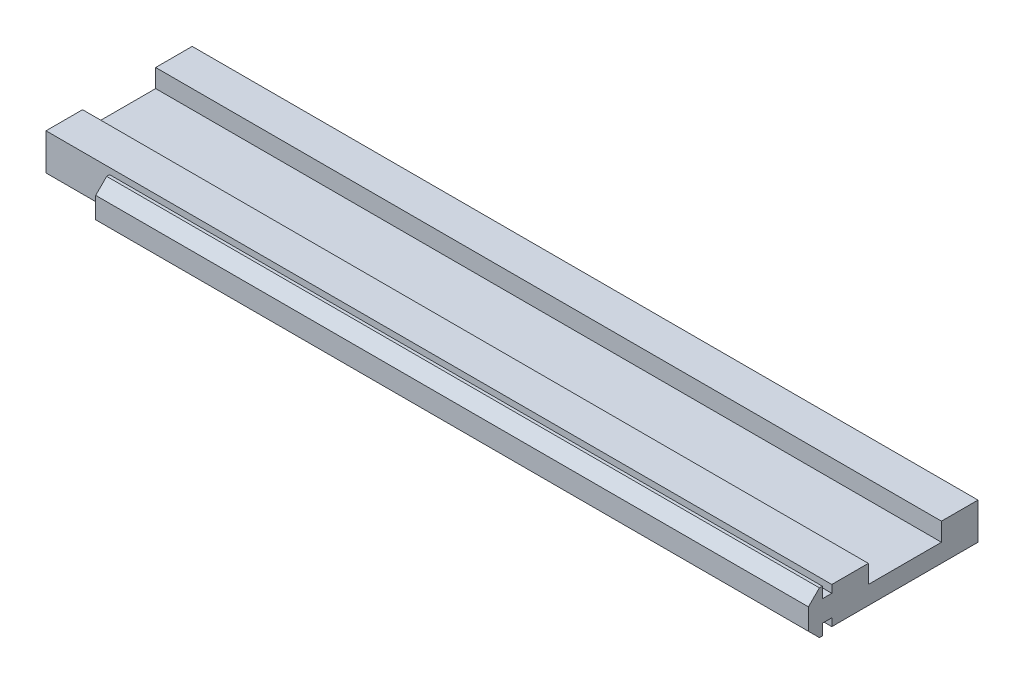
ISO-10303-21;
HEADER;
FILE_DESCRIPTION(('STEP AP214'),'2;1');
FILE_NAME('part.step','',(''),(''),'','','');
FILE_SCHEMA(('AUTOMOTIVE_DESIGN { 1 0 10303 214 1 1 1 1 }'));
ENDSEC;
DATA;
#1=APPLICATION_CONTEXT('core data for automotive mechanical design processes');
#2=APPLICATION_PROTOCOL_DEFINITION('international standard','automotive_design',2000,#1);
#3=PRODUCT_CONTEXT('',#1,'mechanical');
#4=PRODUCT('Part','Part','',(#3));
#5=PRODUCT_RELATED_PRODUCT_CATEGORY('part','',(#4));
#6=PRODUCT_DEFINITION_FORMATION('','',#4);
#7=PRODUCT_DEFINITION_CONTEXT('part definition',#1,'design');
#8=PRODUCT_DEFINITION('design','',#6,#7);
#9=PRODUCT_DEFINITION_SHAPE('','',#8);
#10=(LENGTH_UNIT() NAMED_UNIT(*) SI_UNIT(.MILLI.,.METRE.));
#11=(NAMED_UNIT(*) PLANE_ANGLE_UNIT() SI_UNIT($,.RADIAN.));
#12=(NAMED_UNIT(*) SI_UNIT($,.STERADIAN.) SOLID_ANGLE_UNIT());
#13=UNCERTAINTY_MEASURE_WITH_UNIT(LENGTH_MEASURE(1.E-05),#10,'distance_accuracy_value','');
#14=(GEOMETRIC_REPRESENTATION_CONTEXT(3) GLOBAL_UNCERTAINTY_ASSIGNED_CONTEXT((#13)) GLOBAL_UNIT_ASSIGNED_CONTEXT((#10,
#11,#12)) REPRESENTATION_CONTEXT('',''));
#15=CARTESIAN_POINT('',(0.,0.,0.));
#16=DIRECTION('',(0.,0.,1.));
#17=DIRECTION('',(1.,0.,0.));
#18=AXIS2_PLACEMENT_3D('',#15,#16,#17);
#19=CARTESIAN_POINT('',(925.,0.,90.1082240909334));
#20=DIRECTION('',(0.,0.,-1.));
#21=DIRECTION('',(-1.,0.,0.));
#22=AXIS2_PLACEMENT_3D('',#19,#20,#21);
#23=PLANE('',#22);
#24=DIRECTION('',(-1.,0.,0.));
#25=VECTOR('',#24,1.);
#26=CARTESIAN_POINT('',(925.,4.99999999999999,90.1082240909334));
#27=LINE('',#26,#25);
#28=CARTESIAN_POINT('',(710.,4.99999999999999,90.1082240909334));
#29=VERTEX_POINT('',#28);
#30=CARTESIAN_POINT('',(495.,4.99999999999999,90.1082240909334));
#31=VERTEX_POINT('',#30);
#32=EDGE_CURVE('E50',#29,#31,#27,.T.);
#33=ORIENTED_EDGE('',*,*,#32,.F.);
#34=DIRECTION('',(0.,-1.,0.));
#35=VECTOR('',#34,1.);
#36=CARTESIAN_POINT('',(710.,0.,90.1082240909334));
#37=LINE('',#36,#35);
#38=CARTESIAN_POINT('',(710.,-5.00000000000001,90.1082240909334));
#39=VERTEX_POINT('',#38);
#40=EDGE_CURVE('E231',#29,#39,#37,.T.);
#41=ORIENTED_EDGE('',*,*,#40,.T.);
#42=DIRECTION('',(-1.,0.,0.));
#43=VECTOR('',#42,1.);
#44=CARTESIAN_POINT('',(925.,-5.00000000000001,90.1082240909334));
#45=LINE('',#44,#43);
#46=CARTESIAN_POINT('',(495.,-5.00000000000001,90.1082240909334));
#47=VERTEX_POINT('',#46);
#48=EDGE_CURVE('E275',#39,#47,#45,.T.);
#49=ORIENTED_EDGE('',*,*,#48,.T.);
#50=DIRECTION('',(0.,-1.,0.));
#51=VECTOR('',#50,1.);
#52=CARTESIAN_POINT('',(495.,0.,90.1082240909334));
#53=LINE('',#52,#51);
#54=EDGE_CURVE('E251',#31,#47,#53,.T.);
#55=ORIENTED_EDGE('',*,*,#54,.F.);
#56=EDGE_LOOP('',(#33,#41,#49,#55));
#57=FACE_BOUND('',#56,.T.);
#58=ADVANCED_FACE('F43',(#57),#23,.T.);
#59=CARTESIAN_POINT('',(925.,4.99999999999999,0.));
#60=DIRECTION('',(0.,1.,0.));
#61=DIRECTION('',(0.,0.,1.));
#62=AXIS2_PLACEMENT_3D('',#59,#60,#61);
#63=PLANE('',#62);
#64=DIRECTION('',(-1.,0.,0.));
#65=VECTOR('',#64,1.);
#66=CARTESIAN_POINT('',(925.,4.99999999999999,100.108224090933));
#67=LINE('',#66,#65);
#68=CARTESIAN_POINT('',(710.,4.99999999999999,100.108224090933));
#69=VERTEX_POINT('',#68);
#70=CARTESIAN_POINT('',(495.,4.99999999999999,100.108224090933));
#71=VERTEX_POINT('',#70);
#72=EDGE_CURVE('E287',#69,#71,#67,.T.);
#73=ORIENTED_EDGE('',*,*,#72,.F.);
#74=DIRECTION('',(0.,0.,-1.));
#75=VECTOR('',#74,1.);
#76=CARTESIAN_POINT('',(710.,4.99999999999999,0.));
#77=LINE('',#76,#75);
#78=EDGE_CURVE('E247',#69,#29,#77,.T.);
#79=ORIENTED_EDGE('',*,*,#78,.T.);
#80=ORIENTED_EDGE('',*,*,#32,.T.);
#81=DIRECTION('',(0.,0.,-1.));
#82=VECTOR('',#81,1.);
#83=CARTESIAN_POINT('',(495.,4.99999999999999,0.));
#84=LINE('',#83,#82);
#85=EDGE_CURVE('E254',#71,#31,#84,.T.);
#86=ORIENTED_EDGE('',*,*,#85,.F.);
#87=EDGE_LOOP('',(#73,#79,#80,#86));
#88=FACE_BOUND('',#87,.T.);
#89=ADVANCED_FACE('F293',(#88),#63,.T.);
#90=CARTESIAN_POINT('',(925.,0.,100.108224090933));
#91=DIRECTION('',(0.,0.,1.));
#92=DIRECTION('',(1.,0.,0.));
#93=AXIS2_PLACEMENT_3D('',#90,#91,#92);
#94=PLANE('',#93);
#95=DIRECTION('',(-1.,0.,0.));
#96=VECTOR('',#95,1.);
#97=CARTESIAN_POINT('',(925.,0.,100.108224090933));
#98=LINE('',#97,#96);
#99=CARTESIAN_POINT('',(710.,0.,100.108224090933));
#100=VERTEX_POINT('',#99);
#101=CARTESIAN_POINT('',(495.,0.,100.108224090933));
#102=VERTEX_POINT('',#101);
#103=EDGE_CURVE('E285',#100,#102,#98,.T.);
#104=ORIENTED_EDGE('',*,*,#103,.F.);
#105=DIRECTION('',(0.,1.,0.));
#106=VECTOR('',#105,1.);
#107=CARTESIAN_POINT('',(710.,0.,100.108224090933));
#108=LINE('',#107,#106);
#109=EDGE_CURVE('E244',#100,#69,#108,.T.);
#110=ORIENTED_EDGE('',*,*,#109,.T.);
#111=ORIENTED_EDGE('',*,*,#72,.T.);
#112=DIRECTION('',(0.,1.,0.));
#113=VECTOR('',#112,1.);
#114=CARTESIAN_POINT('',(495.,0.,100.108224090933));
#115=LINE('',#114,#113);
#116=EDGE_CURVE('E257',#102,#71,#115,.T.);
#117=ORIENTED_EDGE('',*,*,#116,.F.);
#118=EDGE_LOOP('',(#104,#110,#111,#117));
#119=FACE_BOUND('',#118,.T.);
#120=ADVANCED_FACE('F303',(#119),#94,.T.);
#121=CARTESIAN_POINT('',(925.,0.,0.));
#122=DIRECTION('',(0.,1.,0.));
#123=DIRECTION('',(0.,0.,1.));
#124=AXIS2_PLACEMENT_3D('',#121,#122,#123);
#125=PLANE('',#124);
#126=DIRECTION('',(-1.,0.,0.));
#127=VECTOR('',#126,1.);
#128=CARTESIAN_POINT('',(925.,0.,120.108224090933));
#129=LINE('',#128,#127);
#130=CARTESIAN_POINT('',(710.,0.,120.108224090933));
#131=VERTEX_POINT('',#130);
#132=CARTESIAN_POINT('',(495.,0.,120.108224090933));
#133=VERTEX_POINT('',#132);
#134=EDGE_CURVE('E283',#131,#133,#129,.T.);
#135=ORIENTED_EDGE('',*,*,#134,.F.);
#136=DIRECTION('',(0.,0.,-1.));
#137=VECTOR('',#136,1.);
#138=CARTESIAN_POINT('',(710.,0.,0.));
#139=LINE('',#138,#137);
#140=EDGE_CURVE('E241',#131,#100,#139,.T.);
#141=ORIENTED_EDGE('',*,*,#140,.T.);
#142=ORIENTED_EDGE('',*,*,#103,.T.);
#143=DIRECTION('',(0.,0.,-1.));
#144=VECTOR('',#143,1.);
#145=CARTESIAN_POINT('',(495.,0.,0.));
#146=LINE('',#145,#144);
#147=EDGE_CURVE('E260',#133,#102,#146,.T.);
#148=ORIENTED_EDGE('',*,*,#147,.F.);
#149=EDGE_LOOP('',(#135,#141,#142,#148));
#150=FACE_BOUND('',#149,.T.);
#151=ADVANCED_FACE('F309',(#150),#125,.T.);
#152=CARTESIAN_POINT('',(925.,0.,120.108224090933));
#153=DIRECTION('',(0.,0.,-1.));
#154=DIRECTION('',(-1.,0.,0.));
#155=AXIS2_PLACEMENT_3D('',#152,#153,#154);
#156=PLANE('',#155);
#157=DIRECTION('',(-1.,0.,0.));
#158=VECTOR('',#157,1.);
#159=CARTESIAN_POINT('',(925.,5.,120.108224090933));
#160=LINE('',#159,#158);
#161=CARTESIAN_POINT('',(710.,5.,120.108224090933));
#162=VERTEX_POINT('',#161);
#163=CARTESIAN_POINT('',(495.,5.,120.108224090933));
#164=VERTEX_POINT('',#163);
#165=EDGE_CURVE('E281',#162,#164,#160,.T.);
#166=ORIENTED_EDGE('',*,*,#165,.F.);
#167=DIRECTION('',(0.,-1.,0.));
#168=VECTOR('',#167,1.);
#169=CARTESIAN_POINT('',(710.,0.,120.108224090933));
#170=LINE('',#169,#168);
#171=EDGE_CURVE('E238',#162,#131,#170,.T.);
#172=ORIENTED_EDGE('',*,*,#171,.T.);
#173=ORIENTED_EDGE('',*,*,#134,.T.);
#174=DIRECTION('',(0.,-1.,0.));
#175=VECTOR('',#174,1.);
#176=CARTESIAN_POINT('',(495.,0.,120.108224090933));
#177=LINE('',#176,#175);
#178=EDGE_CURVE('E263',#164,#133,#177,.T.);
#179=ORIENTED_EDGE('',*,*,#178,.F.);
#180=EDGE_LOOP('',(#166,#172,#173,#179));
#181=FACE_BOUND('',#180,.T.);
#182=ADVANCED_FACE('F313',(#181),#156,.T.);
#183=CARTESIAN_POINT('',(925.,5.,0.));
#184=DIRECTION('',(0.,1.,0.));
#185=DIRECTION('',(0.,0.,1.));
#186=AXIS2_PLACEMENT_3D('',#183,#184,#185);
#187=PLANE('',#186);
#188=DIRECTION('',(-1.,0.,0.));
#189=VECTOR('',#188,1.);
#190=CARTESIAN_POINT('',(925.,5.,130.108224090933));
#191=LINE('',#190,#189);
#192=CARTESIAN_POINT('',(710.,5.,130.108224090933));
#193=VERTEX_POINT('',#192);
#194=CARTESIAN_POINT('',(495.,5.,130.108224090933));
#195=VERTEX_POINT('',#194);
#196=EDGE_CURVE('E279',#193,#195,#191,.T.);
#197=ORIENTED_EDGE('',*,*,#196,.F.);
#198=DIRECTION('',(0.,0.,-1.));
#199=VECTOR('',#198,1.);
#200=CARTESIAN_POINT('',(710.,5.,0.));
#201=LINE('',#200,#199);
#202=EDGE_CURVE('E235',#193,#162,#201,.T.);
#203=ORIENTED_EDGE('',*,*,#202,.T.);
#204=ORIENTED_EDGE('',*,*,#165,.T.);
#205=DIRECTION('',(0.,0.,-1.));
#206=VECTOR('',#205,1.);
#207=CARTESIAN_POINT('',(495.,5.,0.));
#208=LINE('',#207,#206);
#209=EDGE_CURVE('E266',#195,#164,#208,.T.);
#210=ORIENTED_EDGE('',*,*,#209,.F.);
#211=EDGE_LOOP('',(#197,#203,#204,#210));
#212=FACE_BOUND('',#211,.T.);
#213=ADVANCED_FACE('F317',(#212),#187,.T.);
#214=CARTESIAN_POINT('',(925.,0.,130.108224090933));
#215=DIRECTION('',(0.,0.,1.));
#216=DIRECTION('',(1.,0.,0.));
#217=AXIS2_PLACEMENT_3D('',#214,#215,#216);
#218=PLANE('',#217);
#219=DIRECTION('',(-1.,0.,0.));
#220=VECTOR('',#219,1.);
#221=CARTESIAN_POINT('',(925.,2.9,130.108224090933));
#222=LINE('',#221,#220);
#223=CARTESIAN_POINT('',(710.,2.9,130.108224090933));
#224=VERTEX_POINT('',#223);
#225=CARTESIAN_POINT('',(515.,2.9,130.108224090933));
#226=VERTEX_POINT('',#225);
#227=EDGE_CURVE('E226',#224,#226,#222,.T.);
#228=ORIENTED_EDGE('',*,*,#227,.F.);
#229=DIRECTION('',(0.,1.,0.));
#230=VECTOR('',#229,1.);
#231=CARTESIAN_POINT('',(710.,0.,130.108224090933));
#232=LINE('',#231,#230);
#233=EDGE_CURVE('E232',#224,#193,#232,.T.);
#234=ORIENTED_EDGE('',*,*,#233,.T.);
#235=ORIENTED_EDGE('',*,*,#196,.T.);
#236=DIRECTION('',(0.,1.,0.));
#237=VECTOR('',#236,1.);
#238=CARTESIAN_POINT('',(495.,0.,130.108224090933));
#239=LINE('',#238,#237);
#240=CARTESIAN_POINT('',(495.,-5.,130.108224090933));
#241=VERTEX_POINT('',#240);
#242=EDGE_CURVE('E269',#241,#195,#239,.T.);
#243=ORIENTED_EDGE('',*,*,#242,.F.);
#244=DIRECTION('',(-1.,0.,0.));
#245=VECTOR('',#244,1.);
#246=CARTESIAN_POINT('',(925.,-5.,130.108224090933));
#247=LINE('',#246,#245);
#248=CARTESIAN_POINT('',(710.,-5.,130.108224090933));
#249=VERTEX_POINT('',#248);
#250=EDGE_CURVE('E277',#249,#241,#247,.T.);
#251=ORIENTED_EDGE('',*,*,#250,.F.);
#252=CARTESIAN_POINT('',(710.,-2.9,130.108224090933));
#253=VERTEX_POINT('',#252);
#254=EDGE_CURVE('E229',#249,#253,#232,.T.);
#255=ORIENTED_EDGE('',*,*,#254,.T.);
#256=DIRECTION('',(1.,0.,0.));
#257=VECTOR('',#256,1.);
#258=CARTESIAN_POINT('',(925.,-2.9,130.108224090933));
#259=LINE('',#258,#257);
#260=CARTESIAN_POINT('',(515.,-2.9,130.108224090933));
#261=VERTEX_POINT('',#260);
#262=EDGE_CURVE('E223',#261,#253,#259,.T.);
#263=ORIENTED_EDGE('',*,*,#262,.F.);
#264=DIRECTION('',(0.,-1.,0.));
#265=VECTOR('',#264,1.);
#266=CARTESIAN_POINT('',(515.,9.24478202242676,130.108224090933));
#267=LINE('',#266,#265);
#268=EDGE_CURVE('E57',#226,#261,#267,.T.);
#269=ORIENTED_EDGE('',*,*,#268,.F.);
#270=EDGE_LOOP('',(#228,#234,#235,#243,#251,#255,#263,#269));
#271=FACE_BOUND('',#270,.T.);
#272=ADVANCED_FACE('F320',(#271),#218,.T.);
#273=CARTESIAN_POINT('',(925.,-5.00000000000002,0.));
#274=DIRECTION('',(0.,-1.,0.));
#275=DIRECTION('',(0.,0.,-1.));
#276=AXIS2_PLACEMENT_3D('',#273,#274,#275);
#277=PLANE('',#276);
#278=ORIENTED_EDGE('',*,*,#48,.F.);
#279=DIRECTION('',(0.,0.,1.));
#280=VECTOR('',#279,1.);
#281=CARTESIAN_POINT('',(710.,-5.00000000000002,0.));
#282=LINE('',#281,#280);
#283=EDGE_CURVE('E11',#39,#249,#282,.T.);
#284=ORIENTED_EDGE('',*,*,#283,.T.);
#285=ORIENTED_EDGE('',*,*,#250,.T.);
#286=DIRECTION('',(0.,0.,1.));
#287=VECTOR('',#286,1.);
#288=CARTESIAN_POINT('',(495.,-5.00000000000002,0.));
#289=LINE('',#288,#287);
#290=EDGE_CURVE('E272',#47,#241,#289,.T.);
#291=ORIENTED_EDGE('',*,*,#290,.F.);
#292=EDGE_LOOP('',(#278,#284,#285,#291));
#293=FACE_BOUND('',#292,.T.);
#294=ADVANCED_FACE('F323',(#293),#277,.T.);
#295=CARTESIAN_POINT('',(495.,0.,0.));
#296=DIRECTION('',(1.,0.,0.));
#297=DIRECTION('',(0.,0.,-1.));
#298=AXIS2_PLACEMENT_3D('',#295,#296,#297);
#299=PLANE('',#298);
#300=ORIENTED_EDGE('',*,*,#242,.T.);
#301=ORIENTED_EDGE('',*,*,#209,.T.);
#302=ORIENTED_EDGE('',*,*,#178,.T.);
#303=ORIENTED_EDGE('',*,*,#147,.T.);
#304=ORIENTED_EDGE('',*,*,#116,.T.);
#305=ORIENTED_EDGE('',*,*,#85,.T.);
#306=ORIENTED_EDGE('',*,*,#54,.T.);
#307=ORIENTED_EDGE('',*,*,#290,.T.);
#308=EDGE_LOOP('',(#300,#301,#302,#303,#304,#305,#306,#307));
#309=FACE_BOUND('',#308,.T.);
#310=ADVANCED_FACE('F298',(#309),#299,.F.);
#311=CARTESIAN_POINT('',(515.,0.,0.));
#312=DIRECTION('',(-1.,0.,0.));
#313=DIRECTION('',(0.,0.,1.));
#314=AXIS2_PLACEMENT_3D('',#311,#312,#313);
#315=PLANE('',#314);
#316=ORIENTED_EDGE('',*,*,#268,.T.);
#317=DIRECTION('',(0.,0.,-1.));
#318=VECTOR('',#317,1.);
#319=CARTESIAN_POINT('',(515.,-2.9,132.708224090933));
#320=LINE('',#319,#318);
#321=CARTESIAN_POINT('',(515.,-2.9,132.708224090933));
#322=VERTEX_POINT('',#321);
#323=EDGE_CURVE('E197',#322,#261,#320,.T.);
#324=ORIENTED_EDGE('',*,*,#323,.F.);
#325=DIRECTION('',(0.,1.,0.));
#326=VECTOR('',#325,1.);
#327=CARTESIAN_POINT('',(515.,-5.9,132.708224090933));
#328=LINE('',#327,#326);
#329=CARTESIAN_POINT('',(515.,-5.9,132.708224090933));
#330=VERTEX_POINT('',#329);
#331=EDGE_CURVE('E200',#330,#322,#328,.T.);
#332=ORIENTED_EDGE('',*,*,#331,.F.);
#333=DIRECTION('',(0.,0.,-1.));
#334=VECTOR('',#333,1.);
#335=CARTESIAN_POINT('',(515.,-5.9,133.506142562916));
#336=LINE('',#335,#334);
#337=CARTESIAN_POINT('',(515.,-5.9,133.506142562916));
#338=VERTEX_POINT('',#337);
#339=EDGE_CURVE('E204',#338,#330,#336,.T.);
#340=ORIENTED_EDGE('',*,*,#339,.F.);
#341=DIRECTION('',(0.,-0.707106781186548,-0.707106781186547));
#342=VECTOR('',#341,1.);
#343=CARTESIAN_POINT('',(515.,-2.89791847198287,136.508224090933));
#344=LINE('',#343,#342);
#345=CARTESIAN_POINT('',(515.,-2.89791847198287,136.508224090933));
#346=VERTEX_POINT('',#345);
#347=EDGE_CURVE('E208',#346,#338,#344,.T.);
#348=ORIENTED_EDGE('',*,*,#347,.F.);
#349=DIRECTION('',(0.,-1.,0.));
#350=VECTOR('',#349,1.);
#351=CARTESIAN_POINT('',(515.,2.89791847198288,136.508224090933));
#352=LINE('',#351,#350);
#353=CARTESIAN_POINT('',(515.,2.89791847198288,136.508224090933));
#354=VERTEX_POINT('',#353);
#355=EDGE_CURVE('E212',#354,#346,#352,.T.);
#356=ORIENTED_EDGE('',*,*,#355,.F.);
#357=DIRECTION('',(0.,-0.707106781186545,0.70710678118655));
#358=VECTOR('',#357,1.);
#359=CARTESIAN_POINT('',(515.,5.9,133.506142562916));
#360=LINE('',#359,#358);
#361=CARTESIAN_POINT('',(515.,5.9,133.506142562916));
#362=VERTEX_POINT('',#361);
#363=EDGE_CURVE('E171',#362,#354,#360,.T.);
#364=ORIENTED_EDGE('',*,*,#363,.F.);
#365=DIRECTION('',(0.,0.,1.));
#366=VECTOR('',#365,1.);
#367=CARTESIAN_POINT('',(515.,5.9,132.708224090933));
#368=LINE('',#367,#366);
#369=CARTESIAN_POINT('',(515.,5.9,132.708224090933));
#370=VERTEX_POINT('',#369);
#371=EDGE_CURVE('E164',#370,#362,#368,.T.);
#372=ORIENTED_EDGE('',*,*,#371,.F.);
#373=DIRECTION('',(0.,1.,0.));
#374=VECTOR('',#373,1.);
#375=CARTESIAN_POINT('',(515.,2.9,132.708224090933));
#376=LINE('',#375,#374);
#377=CARTESIAN_POINT('',(515.,2.9,132.708224090933));
#378=VERTEX_POINT('',#377);
#379=EDGE_CURVE('E168',#378,#370,#376,.T.);
#380=ORIENTED_EDGE('',*,*,#379,.F.);
#381=DIRECTION('',(0.,0.,1.));
#382=VECTOR('',#381,1.);
#383=CARTESIAN_POINT('',(515.,2.9,129.908224090933));
#384=LINE('',#383,#382);
#385=EDGE_CURVE('E195',#226,#378,#384,.T.);
#386=ORIENTED_EDGE('',*,*,#385,.F.);
#387=EDGE_LOOP('',(#316,#324,#332,#340,#348,#356,#364,#372,#380,#386));
#388=FACE_BOUND('',#387,.T.);
#389=ADVANCED_FACE('F166',(#388),#315,.T.);
#390=CARTESIAN_POINT('',(710.,0.,0.));
#391=DIRECTION('',(1.,0.,0.));
#392=DIRECTION('',(0.,0.,-1.));
#393=AXIS2_PLACEMENT_3D('',#390,#391,#392);
#394=PLANE('',#393);
#395=ORIENTED_EDGE('',*,*,#233,.F.);
#396=DIRECTION('',(0.,0.,1.));
#397=VECTOR('',#396,1.);
#398=CARTESIAN_POINT('',(710.,2.9,129.908224090933));
#399=LINE('',#398,#397);
#400=CARTESIAN_POINT('',(710.,2.9,132.708224090933));
#401=VERTEX_POINT('',#400);
#402=EDGE_CURVE('E185',#224,#401,#399,.T.);
#403=ORIENTED_EDGE('',*,*,#402,.T.);
#404=DIRECTION('',(0.,1.,0.));
#405=VECTOR('',#404,1.);
#406=CARTESIAN_POINT('',(710.,2.9,132.708224090933));
#407=LINE('',#406,#405);
#408=CARTESIAN_POINT('',(710.,5.9,132.708224090933));
#409=VERTEX_POINT('',#408);
#410=EDGE_CURVE('E347',#401,#409,#407,.T.);
#411=ORIENTED_EDGE('',*,*,#410,.T.);
#412=DIRECTION('',(0.,0.,1.));
#413=VECTOR('',#412,1.);
#414=CARTESIAN_POINT('',(710.,5.9,132.708224090933));
#415=LINE('',#414,#413);
#416=CARTESIAN_POINT('',(710.,5.9,133.506142562916));
#417=VERTEX_POINT('',#416);
#418=EDGE_CURVE('E181',#409,#417,#415,.T.);
#419=ORIENTED_EDGE('',*,*,#418,.T.);
#420=DIRECTION('',(0.,-0.707106781186545,0.70710678118655));
#421=VECTOR('',#420,1.);
#422=CARTESIAN_POINT('',(710.,5.9,133.506142562916));
#423=LINE('',#422,#421);
#424=CARTESIAN_POINT('',(710.,2.89791847198288,136.508224090933));
#425=VERTEX_POINT('',#424);
#426=EDGE_CURVE('E344',#417,#425,#423,.T.);
#427=ORIENTED_EDGE('',*,*,#426,.T.);
#428=DIRECTION('',(0.,-1.,0.));
#429=VECTOR('',#428,1.);
#430=CARTESIAN_POINT('',(710.,2.89791847198288,136.508224090933));
#431=LINE('',#430,#429);
#432=CARTESIAN_POINT('',(710.,-2.89791847198287,136.508224090933));
#433=VERTEX_POINT('',#432);
#434=EDGE_CURVE('E341',#425,#433,#431,.T.);
#435=ORIENTED_EDGE('',*,*,#434,.T.);
#436=DIRECTION('',(0.,-0.707106781186548,-0.707106781186547));
#437=VECTOR('',#436,1.);
#438=CARTESIAN_POINT('',(710.,-2.89791847198287,136.508224090933));
#439=LINE('',#438,#437);
#440=CARTESIAN_POINT('',(710.,-5.9,133.506142562916));
#441=VERTEX_POINT('',#440);
#442=EDGE_CURVE('E338',#433,#441,#439,.T.);
#443=ORIENTED_EDGE('',*,*,#442,.T.);
#444=DIRECTION('',(0.,0.,-1.));
#445=VECTOR('',#444,1.);
#446=CARTESIAN_POINT('',(710.,-5.9,133.506142562916));
#447=LINE('',#446,#445);
#448=CARTESIAN_POINT('',(710.,-5.9,132.708224090933));
#449=VERTEX_POINT('',#448);
#450=EDGE_CURVE('E334',#441,#449,#447,.T.);
#451=ORIENTED_EDGE('',*,*,#450,.T.);
#452=DIRECTION('',(0.,1.,0.));
#453=VECTOR('',#452,1.);
#454=CARTESIAN_POINT('',(710.,-5.9,132.708224090933));
#455=LINE('',#454,#453);
#456=CARTESIAN_POINT('',(710.,-2.9,132.708224090933));
#457=VERTEX_POINT('',#456);
#458=EDGE_CURVE('E332',#449,#457,#455,.T.);
#459=ORIENTED_EDGE('',*,*,#458,.T.);
#460=DIRECTION('',(0.,0.,-1.));
#461=VECTOR('',#460,1.);
#462=CARTESIAN_POINT('',(710.,-2.9,132.708224090933));
#463=LINE('',#462,#461);
#464=EDGE_CURVE('E227',#457,#253,#463,.T.);
#465=ORIENTED_EDGE('',*,*,#464,.T.);
#466=ORIENTED_EDGE('',*,*,#254,.F.);
#467=ORIENTED_EDGE('',*,*,#283,.F.);
#468=ORIENTED_EDGE('',*,*,#40,.F.);
#469=ORIENTED_EDGE('',*,*,#78,.F.);
#470=ORIENTED_EDGE('',*,*,#109,.F.);
#471=ORIENTED_EDGE('',*,*,#140,.F.);
#472=ORIENTED_EDGE('',*,*,#171,.F.);
#473=ORIENTED_EDGE('',*,*,#202,.F.);
#474=EDGE_LOOP('',(#395,#403,#411,#419,#427,#435,#443,#451,#459,#465,#466,#467,#468,#469,#470,
#471,#472,#473));
#475=FACE_BOUND('',#474,.T.);
#476=ADVANCED_FACE('F306',(#475),#394,.T.);
#477=CARTESIAN_POINT('',(501.479644975076,2.9,129.908224090933));
#478=DIRECTION('',(0.,1.,0.));
#479=DIRECTION('',(0.,0.,1.));
#480=AXIS2_PLACEMENT_3D('',#477,#478,#479);
#481=PLANE('',#480);
#482=ORIENTED_EDGE('',*,*,#402,.F.);
#483=ORIENTED_EDGE('',*,*,#227,.T.);
#484=ORIENTED_EDGE('',*,*,#385,.T.);
#485=DIRECTION('',(1.,0.,0.));
#486=VECTOR('',#485,1.);
#487=CARTESIAN_POINT('',(501.479644975076,2.9,132.708224090933));
#488=LINE('',#487,#486);
#489=EDGE_CURVE('E189',#378,#401,#488,.T.);
#490=ORIENTED_EDGE('',*,*,#489,.T.);
#491=EDGE_LOOP('',(#482,#483,#484,#490));
#492=FACE_BOUND('',#491,.T.);
#493=ADVANCED_FACE('F350',(#492),#481,.T.);
#494=CARTESIAN_POINT('',(501.479644975076,-2.9,132.708224090933));
#495=DIRECTION('',(0.,-1.,0.));
#496=DIRECTION('',(0.,0.,-1.));
#497=AXIS2_PLACEMENT_3D('',#494,#495,#496);
#498=PLANE('',#497);
#499=ORIENTED_EDGE('',*,*,#323,.T.);
#500=ORIENTED_EDGE('',*,*,#262,.T.);
#501=ORIENTED_EDGE('',*,*,#464,.F.);
#502=DIRECTION('',(1.,0.,0.));
#503=VECTOR('',#502,1.);
#504=CARTESIAN_POINT('',(501.479644975076,-2.9,132.708224090933));
#505=LINE('',#504,#503);
#506=EDGE_CURVE('E203',#322,#457,#505,.T.);
#507=ORIENTED_EDGE('',*,*,#506,.F.);
#508=EDGE_LOOP('',(#499,#500,#501,#507));
#509=FACE_BOUND('',#508,.T.);
#510=ADVANCED_FACE('F327',(#509),#498,.T.);
#511=CARTESIAN_POINT('',(501.479644975076,-5.9,132.708224090933));
#512=DIRECTION('',(0.,0.,-1.));
#513=DIRECTION('',(-1.,0.,0.));
#514=AXIS2_PLACEMENT_3D('',#511,#512,#513);
#515=PLANE('',#514);
#516=DIRECTION('',(1.,0.,0.));
#517=VECTOR('',#516,1.);
#518=CARTESIAN_POINT('',(501.479644975076,-5.9,132.708224090933));
#519=LINE('',#518,#517);
#520=EDGE_CURVE('E207',#330,#449,#519,.T.);
#521=ORIENTED_EDGE('',*,*,#520,.F.);
#522=ORIENTED_EDGE('',*,*,#331,.T.);
#523=ORIENTED_EDGE('',*,*,#506,.T.);
#524=ORIENTED_EDGE('',*,*,#458,.F.);
#525=EDGE_LOOP('',(#521,#522,#523,#524));
#526=FACE_BOUND('',#525,.T.);
#527=ADVANCED_FACE('F357',(#526),#515,.T.);
#528=CARTESIAN_POINT('',(501.479644975076,-5.9,133.506142562916));
#529=DIRECTION('',(0.,-1.,0.));
#530=DIRECTION('',(0.,0.,-1.));
#531=AXIS2_PLACEMENT_3D('',#528,#529,#530);
#532=PLANE('',#531);
#533=DIRECTION('',(1.,0.,0.));
#534=VECTOR('',#533,1.);
#535=CARTESIAN_POINT('',(501.479644975076,-5.9,133.506142562916));
#536=LINE('',#535,#534);
#537=EDGE_CURVE('E211',#338,#441,#536,.T.);
#538=ORIENTED_EDGE('',*,*,#537,.F.);
#539=ORIENTED_EDGE('',*,*,#339,.T.);
#540=ORIENTED_EDGE('',*,*,#520,.T.);
#541=ORIENTED_EDGE('',*,*,#450,.F.);
#542=EDGE_LOOP('',(#538,#539,#540,#541));
#543=FACE_BOUND('',#542,.T.);
#544=ADVANCED_FACE('F412',(#543),#532,.T.);
#545=CARTESIAN_POINT('',(501.479644975076,-2.89791847198287,136.508224090933));
#546=DIRECTION('',(0.,-0.707106781186547,0.707106781186548));
#547=DIRECTION('',(0.,-0.707106781186548,-0.707106781186547));
#548=AXIS2_PLACEMENT_3D('',#545,#546,#547);
#549=PLANE('',#548);
#550=DIRECTION('',(1.,0.,0.));
#551=VECTOR('',#550,1.);
#552=CARTESIAN_POINT('',(501.479644975076,-2.89791847198287,136.508224090933));
#553=LINE('',#552,#551);
#554=EDGE_CURVE('E215',#346,#433,#553,.T.);
#555=ORIENTED_EDGE('',*,*,#554,.F.);
#556=ORIENTED_EDGE('',*,*,#347,.T.);
#557=ORIENTED_EDGE('',*,*,#537,.T.);
#558=ORIENTED_EDGE('',*,*,#442,.F.);
#559=EDGE_LOOP('',(#555,#556,#557,#558));
#560=FACE_BOUND('',#559,.T.);
#561=ADVANCED_FACE('F422',(#560),#549,.T.);
#562=CARTESIAN_POINT('',(501.479644975076,2.89791847198288,136.508224090933));
#563=DIRECTION('',(0.,0.,1.));
#564=DIRECTION('',(1.,0.,0.));
#565=AXIS2_PLACEMENT_3D('',#562,#563,#564);
#566=PLANE('',#565);
#567=DIRECTION('',(1.,0.,0.));
#568=VECTOR('',#567,1.);
#569=CARTESIAN_POINT('',(501.479644975076,2.89791847198288,136.508224090933));
#570=LINE('',#569,#568);
#571=EDGE_CURVE('E175',#354,#425,#570,.T.);
#572=ORIENTED_EDGE('',*,*,#571,.F.);
#573=ORIENTED_EDGE('',*,*,#355,.T.);
#574=ORIENTED_EDGE('',*,*,#554,.T.);
#575=ORIENTED_EDGE('',*,*,#434,.F.);
#576=EDGE_LOOP('',(#572,#573,#574,#575));
#577=FACE_BOUND('',#576,.T.);
#578=ADVANCED_FACE('F432',(#577),#566,.T.);
#579=CARTESIAN_POINT('',(501.479644975076,5.9,133.506142562916));
#580=DIRECTION('',(0.,0.70710678118655,0.707106781186545));
#581=DIRECTION('',(0.,-0.707106781186545,0.70710678118655));
#582=AXIS2_PLACEMENT_3D('',#579,#580,#581);
#583=PLANE('',#582);
#584=DIRECTION('',(1.,0.,0.));
#585=VECTOR('',#584,1.);
#586=CARTESIAN_POINT('',(501.479644975076,5.9,133.506142562916));
#587=LINE('',#586,#585);
#588=EDGE_CURVE('E174',#362,#417,#587,.T.);
#589=ORIENTED_EDGE('',*,*,#588,.F.);
#590=ORIENTED_EDGE('',*,*,#363,.T.);
#591=ORIENTED_EDGE('',*,*,#571,.T.);
#592=ORIENTED_EDGE('',*,*,#426,.F.);
#593=EDGE_LOOP('',(#589,#590,#591,#592));
#594=FACE_BOUND('',#593,.T.);
#595=ADVANCED_FACE('F442',(#594),#583,.T.);
#596=CARTESIAN_POINT('',(501.479644975076,5.9,132.708224090933));
#597=DIRECTION('',(0.,1.,0.));
#598=DIRECTION('',(0.,0.,1.));
#599=AXIS2_PLACEMENT_3D('',#596,#597,#598);
#600=PLANE('',#599);
#601=DIRECTION('',(1.,0.,0.));
#602=VECTOR('',#601,1.);
#603=CARTESIAN_POINT('',(501.479644975076,5.9,132.708224090933));
#604=LINE('',#603,#602);
#605=EDGE_CURVE('E178',#370,#409,#604,.T.);
#606=ORIENTED_EDGE('',*,*,#605,.F.);
#607=ORIENTED_EDGE('',*,*,#371,.T.);
#608=ORIENTED_EDGE('',*,*,#588,.T.);
#609=ORIENTED_EDGE('',*,*,#418,.F.);
#610=EDGE_LOOP('',(#606,#607,#608,#609));
#611=FACE_BOUND('',#610,.T.);
#612=ADVANCED_FACE('F179',(#611),#600,.T.);
#613=CARTESIAN_POINT('',(501.479644975076,2.9,132.708224090933));
#614=DIRECTION('',(0.,0.,-1.));
#615=DIRECTION('',(-1.,0.,0.));
#616=AXIS2_PLACEMENT_3D('',#613,#614,#615);
#617=PLANE('',#616);
#618=ORIENTED_EDGE('',*,*,#489,.F.);
#619=ORIENTED_EDGE('',*,*,#379,.T.);
#620=ORIENTED_EDGE('',*,*,#605,.T.);
#621=ORIENTED_EDGE('',*,*,#410,.F.);
#622=EDGE_LOOP('',(#618,#619,#620,#621));
#623=FACE_BOUND('',#622,.T.);
#624=ADVANCED_FACE('F187',(#623),#617,.T.);
#625=CLOSED_SHELL('',(#58,#89,#120,#151,#182,#213,#272,#294,#310,#389,#476,#493,#510,#527,#544,
#561,#578,#595,#612,#624));
#626=MANIFOLD_SOLID_BREP('B2',#625);
#627=ADVANCED_BREP_SHAPE_REPRESENTATION('',(#18,#626),#14);
#628=SHAPE_DEFINITION_REPRESENTATION(#9,#627);
ENDSEC;
END-ISO-10303-21;
